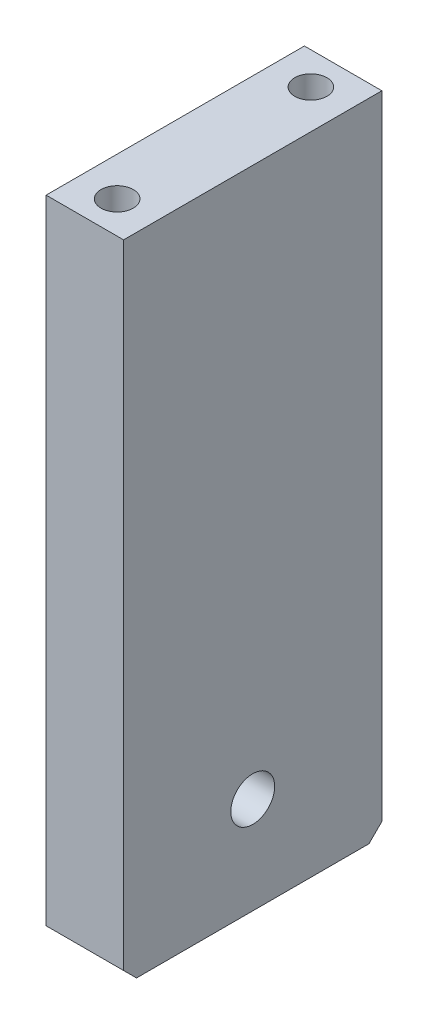
ISO-10303-21;
HEADER;
FILE_DESCRIPTION(('STEP AP214'),'2;1');
FILE_NAME('part.step','',(''),(''),'','','');
FILE_SCHEMA(('AUTOMOTIVE_DESIGN { 1 0 10303 214 1 1 1 1 }'));
ENDSEC;
DATA;
#1=APPLICATION_CONTEXT('core data for automotive mechanical design processes');
#2=APPLICATION_PROTOCOL_DEFINITION('international standard','automotive_design',2000,#1);
#3=PRODUCT_CONTEXT('',#1,'mechanical');
#4=PRODUCT('Part','Part','',(#3));
#5=PRODUCT_RELATED_PRODUCT_CATEGORY('part','',(#4));
#6=PRODUCT_DEFINITION_FORMATION('','',#4);
#7=PRODUCT_DEFINITION_CONTEXT('part definition',#1,'design');
#8=PRODUCT_DEFINITION('design','',#6,#7);
#9=PRODUCT_DEFINITION_SHAPE('','',#8);
#10=(LENGTH_UNIT() NAMED_UNIT(*) SI_UNIT(.MILLI.,.METRE.));
#11=(NAMED_UNIT(*) PLANE_ANGLE_UNIT() SI_UNIT($,.RADIAN.));
#12=(NAMED_UNIT(*) SI_UNIT($,.STERADIAN.) SOLID_ANGLE_UNIT());
#13=UNCERTAINTY_MEASURE_WITH_UNIT(LENGTH_MEASURE(1.E-05),#10,'distance_accuracy_value','');
#14=(GEOMETRIC_REPRESENTATION_CONTEXT(3) GLOBAL_UNCERTAINTY_ASSIGNED_CONTEXT((#13)) GLOBAL_UNIT_ASSIGNED_CONTEXT((#10,
#11,#12)) REPRESENTATION_CONTEXT('',''));
#15=CARTESIAN_POINT('',(0.,0.,0.));
#16=DIRECTION('',(0.,0.,1.));
#17=DIRECTION('',(1.,0.,0.));
#18=AXIS2_PLACEMENT_3D('',#15,#16,#17);
#19=CARTESIAN_POINT('',(6.,100.,20.));
#20=DIRECTION('',(-1.,0.,0.));
#21=DIRECTION('',(0.,0.,1.));
#22=AXIS2_PLACEMENT_3D('',#19,#20,#21);
#23=PLANE('',#22);
#24=CARTESIAN_POINT('',(6.,15.,0.));
#25=DIRECTION('',(1.,0.,0.));
#26=DIRECTION('',(0.,0.,-1.));
#27=AXIS2_PLACEMENT_3D('',#24,#25,#26);
#28=CIRCLE('',#27,3.39999999999999);
#29=CARTESIAN_POINT('',(6.,15.,-3.4));
#30=VERTEX_POINT('',#29);
#31=EDGE_CURVE('E309',#30,#30,#28,.T.);
#32=ORIENTED_EDGE('',*,*,#31,.F.);
#33=EDGE_LOOP('',(#32));
#34=FACE_BOUND('',#33,.T.);
#35=DIRECTION('',(0.,0.,-1.));
#36=VECTOR('',#35,1.);
#37=CARTESIAN_POINT('',(6.,0.,20.));
#38=LINE('',#37,#36);
#39=CARTESIAN_POINT('',(6.,0.,18.));
#40=VERTEX_POINT('',#39);
#41=CARTESIAN_POINT('',(6.,0.,-18.));
#42=VERTEX_POINT('',#41);
#43=EDGE_CURVE('E122',#40,#42,#38,.T.);
#44=ORIENTED_EDGE('',*,*,#43,.T.);
#45=DIRECTION('',(0.,0.707106781186545,-0.70710678118655));
#46=VECTOR('',#45,1.);
#47=CARTESIAN_POINT('',(6.,2.00000000000002,-20.));
#48=LINE('',#47,#46);
#49=CARTESIAN_POINT('',(6.,2.00000000000004,-20.));
#50=VERTEX_POINT('',#49);
#51=EDGE_CURVE('E48',#42,#50,#48,.T.);
#52=ORIENTED_EDGE('',*,*,#51,.T.);
#53=DIRECTION('',(0.,-1.,0.));
#54=VECTOR('',#53,1.);
#55=CARTESIAN_POINT('',(6.,100.,-20.));
#56=LINE('',#55,#54);
#57=CARTESIAN_POINT('',(6.,100.,-20.));
#58=VERTEX_POINT('',#57);
#59=EDGE_CURVE('E145',#58,#50,#56,.T.);
#60=ORIENTED_EDGE('',*,*,#59,.F.);
#61=DIRECTION('',(0.,0.,-1.));
#62=VECTOR('',#61,1.);
#63=CARTESIAN_POINT('',(6.,100.,20.));
#64=LINE('',#63,#62);
#65=CARTESIAN_POINT('',(6.,100.,20.));
#66=VERTEX_POINT('',#65);
#67=EDGE_CURVE('E123',#66,#58,#64,.T.);
#68=ORIENTED_EDGE('',*,*,#67,.F.);
#69=DIRECTION('',(0.,-1.,0.));
#70=VECTOR('',#69,1.);
#71=CARTESIAN_POINT('',(6.,100.,20.));
#72=LINE('',#71,#70);
#73=CARTESIAN_POINT('',(6.,2.00000000000004,20.));
#74=VERTEX_POINT('',#73);
#75=EDGE_CURVE('E133',#66,#74,#72,.T.);
#76=ORIENTED_EDGE('',*,*,#75,.T.);
#77=DIRECTION('',(0.,-0.707106781186545,-0.70710678118655));
#78=VECTOR('',#77,1.);
#79=CARTESIAN_POINT('',(6.,2.00000000000002,20.));
#80=LINE('',#79,#78);
#81=EDGE_CURVE('E55',#74,#40,#80,.T.);
#82=ORIENTED_EDGE('',*,*,#81,.T.);
#83=EDGE_LOOP('',(#44,#52,#60,#68,#76,#82));
#84=FACE_BOUND('',#83,.T.);
#85=ADVANCED_FACE('F40',(#34,#84),#23,.F.);
#86=CARTESIAN_POINT('',(-6.,100.,-20.));
#87=DIRECTION('',(0.,0.,1.));
#88=DIRECTION('',(1.,0.,0.));
#89=AXIS2_PLACEMENT_3D('',#86,#87,#88);
#90=PLANE('',#89);
#91=ORIENTED_EDGE('',*,*,#59,.T.);
#92=DIRECTION('',(-1.,0.,0.));
#93=VECTOR('',#92,1.);
#94=CARTESIAN_POINT('',(-6.,2.00000000000002,-20.));
#95=LINE('',#94,#93);
#96=CARTESIAN_POINT('',(-6.,2.00000000000004,-20.));
#97=VERTEX_POINT('',#96);
#98=EDGE_CURVE('E148',#50,#97,#95,.T.);
#99=ORIENTED_EDGE('',*,*,#98,.T.);
#100=DIRECTION('',(0.,-1.,0.));
#101=VECTOR('',#100,1.);
#102=CARTESIAN_POINT('',(-6.,100.,-20.));
#103=LINE('',#102,#101);
#104=CARTESIAN_POINT('',(-6.,100.,-20.));
#105=VERTEX_POINT('',#104);
#106=EDGE_CURVE('E142',#105,#97,#103,.T.);
#107=ORIENTED_EDGE('',*,*,#106,.F.);
#108=DIRECTION('',(-1.,0.,0.));
#109=VECTOR('',#108,1.);
#110=CARTESIAN_POINT('',(-6.,100.,-20.));
#111=LINE('',#110,#109);
#112=EDGE_CURVE('E126',#58,#105,#111,.T.);
#113=ORIENTED_EDGE('',*,*,#112,.F.);
#114=EDGE_LOOP('',(#91,#99,#107,#113));
#115=FACE_BOUND('',#114,.T.);
#116=ADVANCED_FACE('F165',(#115),#90,.F.);
#117=CARTESIAN_POINT('',(-6.,100.,20.));
#118=DIRECTION('',(1.,0.,0.));
#119=DIRECTION('',(0.,0.,-1.));
#120=AXIS2_PLACEMENT_3D('',#117,#118,#119);
#121=PLANE('',#120);
#122=CARTESIAN_POINT('',(-6.,15.,0.));
#123=DIRECTION('',(1.,0.,0.));
#124=DIRECTION('',(0.,0.,-1.));
#125=AXIS2_PLACEMENT_3D('',#122,#123,#124);
#126=CIRCLE('',#125,3.4);
#127=CARTESIAN_POINT('',(-6.,15.,-3.40000000000001));
#128=VERTEX_POINT('',#127);
#129=EDGE_CURVE('E116',#128,#128,#126,.T.);
#130=ORIENTED_EDGE('',*,*,#129,.T.);
#131=EDGE_LOOP('',(#130));
#132=FACE_BOUND('',#131,.T.);
#133=ORIENTED_EDGE('',*,*,#106,.T.);
#134=DIRECTION('',(0.,-0.707106781186545,0.70710678118655));
#135=VECTOR('',#134,1.);
#136=CARTESIAN_POINT('',(-6.,2.00000000000002,-20.));
#137=LINE('',#136,#135);
#138=CARTESIAN_POINT('',(-6.,0.,-18.));
#139=VERTEX_POINT('',#138);
#140=EDGE_CURVE('E153',#97,#139,#137,.T.);
#141=ORIENTED_EDGE('',*,*,#140,.T.);
#142=DIRECTION('',(0.,0.,1.));
#143=VECTOR('',#142,1.);
#144=CARTESIAN_POINT('',(-6.,0.,20.));
#145=LINE('',#144,#143);
#146=CARTESIAN_POINT('',(-6.,0.,18.));
#147=VERTEX_POINT('',#146);
#148=EDGE_CURVE('E127',#139,#147,#145,.T.);
#149=ORIENTED_EDGE('',*,*,#148,.T.);
#150=DIRECTION('',(0.,0.707106781186545,0.70710678118655));
#151=VECTOR('',#150,1.);
#152=CARTESIAN_POINT('',(-6.,2.00000000000002,20.));
#153=LINE('',#152,#151);
#154=CARTESIAN_POINT('',(-6.,2.00000000000004,20.));
#155=VERTEX_POINT('',#154);
#156=EDGE_CURVE('E151',#147,#155,#153,.T.);
#157=ORIENTED_EDGE('',*,*,#156,.T.);
#158=DIRECTION('',(0.,-1.,0.));
#159=VECTOR('',#158,1.);
#160=CARTESIAN_POINT('',(-6.,100.,20.));
#161=LINE('',#160,#159);
#162=CARTESIAN_POINT('',(-6.,100.,20.));
#163=VERTEX_POINT('',#162);
#164=EDGE_CURVE('E139',#163,#155,#161,.T.);
#165=ORIENTED_EDGE('',*,*,#164,.F.);
#166=DIRECTION('',(0.,0.,1.));
#167=VECTOR('',#166,1.);
#168=CARTESIAN_POINT('',(-6.,100.,20.));
#169=LINE('',#168,#167);
#170=EDGE_CURVE('E129',#105,#163,#169,.T.);
#171=ORIENTED_EDGE('',*,*,#170,.F.);
#172=EDGE_LOOP('',(#133,#141,#149,#157,#165,#171));
#173=FACE_BOUND('',#172,.T.);
#174=ADVANCED_FACE('F169',(#132,#173),#121,.F.);
#175=CARTESIAN_POINT('',(-6.,100.,20.));
#176=DIRECTION('',(0.,0.,-1.));
#177=DIRECTION('',(-1.,0.,0.));
#178=AXIS2_PLACEMENT_3D('',#175,#176,#177);
#179=PLANE('',#178);
#180=ORIENTED_EDGE('',*,*,#164,.T.);
#181=DIRECTION('',(1.,0.,0.));
#182=VECTOR('',#181,1.);
#183=CARTESIAN_POINT('',(6.,2.00000000000002,20.));
#184=LINE('',#183,#182);
#185=EDGE_CURVE('E11',#155,#74,#184,.T.);
#186=ORIENTED_EDGE('',*,*,#185,.T.);
#187=ORIENTED_EDGE('',*,*,#75,.F.);
#188=DIRECTION('',(1.,0.,0.));
#189=VECTOR('',#188,1.);
#190=CARTESIAN_POINT('',(-6.,100.,20.));
#191=LINE('',#190,#189);
#192=EDGE_CURVE('E131',#163,#66,#191,.T.);
#193=ORIENTED_EDGE('',*,*,#192,.F.);
#194=EDGE_LOOP('',(#180,#186,#187,#193));
#195=FACE_BOUND('',#194,.T.);
#196=ADVANCED_FACE('F176',(#195),#179,.F.);
#197=CARTESIAN_POINT('',(0.,100.,0.));
#198=DIRECTION('',(0.,-1.,0.));
#199=DIRECTION('',(0.,0.,-1.));
#200=AXIS2_PLACEMENT_3D('',#197,#198,#199);
#201=PLANE('',#200);
#202=CARTESIAN_POINT('',(0.,100.,-15.));
#203=DIRECTION('',(0.,1.,0.));
#204=DIRECTION('',(0.,0.,1.));
#205=AXIS2_PLACEMENT_3D('',#202,#203,#204);
#206=CIRCLE('',#205,2.49999999999999);
#207=CARTESIAN_POINT('',(0.,100.,-12.5));
#208=VERTEX_POINT('',#207);
#209=EDGE_CURVE('E110',#208,#208,#206,.T.);
#210=ORIENTED_EDGE('',*,*,#209,.F.);
#211=EDGE_LOOP('',(#210));
#212=FACE_BOUND('',#211,.T.);
#213=CARTESIAN_POINT('',(0.,100.,15.));
#214=DIRECTION('',(0.,1.,0.));
#215=DIRECTION('',(0.,0.,1.));
#216=AXIS2_PLACEMENT_3D('',#213,#214,#215);
#217=CIRCLE('',#216,2.49999999999999);
#218=CARTESIAN_POINT('',(0.,100.,17.5));
#219=VERTEX_POINT('',#218);
#220=EDGE_CURVE('E109',#219,#219,#217,.T.);
#221=ORIENTED_EDGE('',*,*,#220,.F.);
#222=EDGE_LOOP('',(#221));
#223=FACE_BOUND('',#222,.T.);
#224=ORIENTED_EDGE('',*,*,#67,.T.);
#225=ORIENTED_EDGE('',*,*,#112,.T.);
#226=ORIENTED_EDGE('',*,*,#170,.T.);
#227=ORIENTED_EDGE('',*,*,#192,.T.);
#228=EDGE_LOOP('',(#224,#225,#226,#227));
#229=FACE_BOUND('',#228,.T.);
#230=ADVANCED_FACE('F179',(#212,#223,#229),#201,.F.);
#231=CARTESIAN_POINT('',(0.,0.,0.));
#232=DIRECTION('',(0.,-1.,0.));
#233=DIRECTION('',(0.,0.,-1.));
#234=AXIS2_PLACEMENT_3D('',#231,#232,#233);
#235=PLANE('',#234);
#236=ORIENTED_EDGE('',*,*,#148,.F.);
#237=DIRECTION('',(1.,0.,0.));
#238=VECTOR('',#237,1.);
#239=CARTESIAN_POINT('',(6.,0.,-18.));
#240=LINE('',#239,#238);
#241=EDGE_CURVE('E62',#139,#42,#240,.T.);
#242=ORIENTED_EDGE('',*,*,#241,.T.);
#243=ORIENTED_EDGE('',*,*,#43,.F.);
#244=DIRECTION('',(-1.,0.,0.));
#245=VECTOR('',#244,1.);
#246=CARTESIAN_POINT('',(-6.,0.,18.));
#247=LINE('',#246,#245);
#248=EDGE_CURVE('E155',#40,#147,#247,.T.);
#249=ORIENTED_EDGE('',*,*,#248,.T.);
#250=EDGE_LOOP('',(#236,#242,#243,#249));
#251=FACE_BOUND('',#250,.T.);
#252=ADVANCED_FACE('F172',(#251),#235,.T.);
#253=CARTESIAN_POINT('',(0.,85.,15.));
#254=DIRECTION('',(0.,1.,0.));
#255=DIRECTION('',(0.,0.,1.));
#256=AXIS2_PLACEMENT_3D('',#253,#254,#255);
#257=CONICAL_SURFACE('',#256,2.49999999999999,1.02974425867665);
#258=CARTESIAN_POINT('',(0.,83.4978484524311,15.));
#259=VERTEX_POINT('',#258);
#260=VERTEX_LOOP('',#259);
#261=FACE_BOUND('',#260,.T.);
#262=CARTESIAN_POINT('',(0.,85.,15.));
#263=DIRECTION('',(0.,1.,0.));
#264=DIRECTION('',(0.,0.,1.));
#265=AXIS2_PLACEMENT_3D('',#262,#263,#264);
#266=CIRCLE('',#265,2.49999999999999);
#267=CARTESIAN_POINT('',(0.,85.,17.5));
#268=VERTEX_POINT('',#267);
#269=EDGE_CURVE('E113',#268,#268,#266,.T.);
#270=ORIENTED_EDGE('',*,*,#269,.T.);
#271=EDGE_LOOP('',(#270));
#272=FACE_BOUND('',#271,.T.);
#273=ADVANCED_FACE('F187',(#261,#272),#257,.F.);
#274=CARTESIAN_POINT('',(0.,100.,15.));
#275=DIRECTION('',(0.,1.,0.));
#276=DIRECTION('',(0.,0.,1.));
#277=AXIS2_PLACEMENT_3D('',#274,#275,#276);
#278=CYLINDRICAL_SURFACE('',#277,2.49999999999999);
#279=ORIENTED_EDGE('',*,*,#269,.F.);
#280=EDGE_LOOP('',(#279));
#281=FACE_BOUND('',#280,.T.);
#282=ORIENTED_EDGE('',*,*,#220,.T.);
#283=EDGE_LOOP('',(#282));
#284=FACE_BOUND('',#283,.T.);
#285=ADVANCED_FACE('F103',(#281,#284),#278,.F.);
#286=CARTESIAN_POINT('',(0.,85.,-15.));
#287=DIRECTION('',(0.,1.,0.));
#288=DIRECTION('',(0.,0.,1.));
#289=AXIS2_PLACEMENT_3D('',#286,#287,#288);
#290=CONICAL_SURFACE('',#289,2.49999999999999,1.02974425867665);
#291=CARTESIAN_POINT('',(0.,83.4978484524311,-15.));
#292=VERTEX_POINT('',#291);
#293=VERTEX_LOOP('',#292);
#294=FACE_BOUND('',#293,.T.);
#295=CARTESIAN_POINT('',(0.,85.,-15.));
#296=DIRECTION('',(0.,1.,0.));
#297=DIRECTION('',(0.,0.,1.));
#298=AXIS2_PLACEMENT_3D('',#295,#296,#297);
#299=CIRCLE('',#298,2.49999999999999);
#300=CARTESIAN_POINT('',(0.,85.,-12.5));
#301=VERTEX_POINT('',#300);
#302=EDGE_CURVE('E107',#301,#301,#299,.T.);
#303=ORIENTED_EDGE('',*,*,#302,.T.);
#304=EDGE_LOOP('',(#303));
#305=FACE_BOUND('',#304,.T.);
#306=ADVANCED_FACE('F99',(#294,#305),#290,.F.);
#307=CARTESIAN_POINT('',(0.,100.,-15.));
#308=DIRECTION('',(0.,1.,0.));
#309=DIRECTION('',(0.,0.,1.));
#310=AXIS2_PLACEMENT_3D('',#307,#308,#309);
#311=CYLINDRICAL_SURFACE('',#310,2.49999999999999);
#312=ORIENTED_EDGE('',*,*,#302,.F.);
#313=EDGE_LOOP('',(#312));
#314=FACE_BOUND('',#313,.T.);
#315=ORIENTED_EDGE('',*,*,#209,.T.);
#316=EDGE_LOOP('',(#315));
#317=FACE_BOUND('',#316,.T.);
#318=ADVANCED_FACE('F102',(#314,#317),#311,.F.);
#319=CARTESIAN_POINT('',(6.,15.,0.));
#320=DIRECTION('',(1.,0.,0.));
#321=DIRECTION('',(0.,0.,-1.));
#322=AXIS2_PLACEMENT_3D('',#319,#320,#321);
#323=CYLINDRICAL_SURFACE('',#322,3.39999999999999);
#324=ORIENTED_EDGE('',*,*,#129,.F.);
#325=EDGE_LOOP('',(#324));
#326=FACE_BOUND('',#325,.T.);
#327=ORIENTED_EDGE('',*,*,#31,.T.);
#328=EDGE_LOOP('',(#327));
#329=FACE_BOUND('',#328,.T.);
#330=ADVANCED_FACE('F203',(#326,#329),#323,.F.);
#331=CARTESIAN_POINT('',(-6.,2.00000000000002,-20.));
#332=DIRECTION('',(0.,-0.70710678118655,-0.707106781186545));
#333=DIRECTION('',(1.,0.,0.));
#334=AXIS2_PLACEMENT_3D('',#331,#332,#333);
#335=PLANE('',#334);
#336=ORIENTED_EDGE('',*,*,#51,.F.);
#337=ORIENTED_EDGE('',*,*,#241,.F.);
#338=ORIENTED_EDGE('',*,*,#140,.F.);
#339=ORIENTED_EDGE('',*,*,#98,.F.);
#340=EDGE_LOOP('',(#336,#337,#338,#339));
#341=FACE_BOUND('',#340,.T.);
#342=ADVANCED_FACE('F167',(#341),#335,.T.);
#343=CARTESIAN_POINT('',(-6.,2.00000000000002,20.));
#344=DIRECTION('',(0.,-0.70710678118655,0.707106781186545));
#345=DIRECTION('',(-1.,0.,0.));
#346=AXIS2_PLACEMENT_3D('',#343,#344,#345);
#347=PLANE('',#346);
#348=ORIENTED_EDGE('',*,*,#156,.F.);
#349=ORIENTED_EDGE('',*,*,#248,.F.);
#350=ORIENTED_EDGE('',*,*,#81,.F.);
#351=ORIENTED_EDGE('',*,*,#185,.F.);
#352=EDGE_LOOP('',(#348,#349,#350,#351));
#353=FACE_BOUND('',#352,.T.);
#354=ADVANCED_FACE('F42',(#353),#347,.T.);
#355=CLOSED_SHELL('',(#85,#116,#174,#196,#230,#252,#273,#285,#306,#318,#330,#342,#354));
#356=MANIFOLD_SOLID_BREP('B2',#355);
#357=ADVANCED_BREP_SHAPE_REPRESENTATION('',(#18,#356),#14);
#358=SHAPE_DEFINITION_REPRESENTATION(#9,#357);
ENDSEC;
END-ISO-10303-21;
